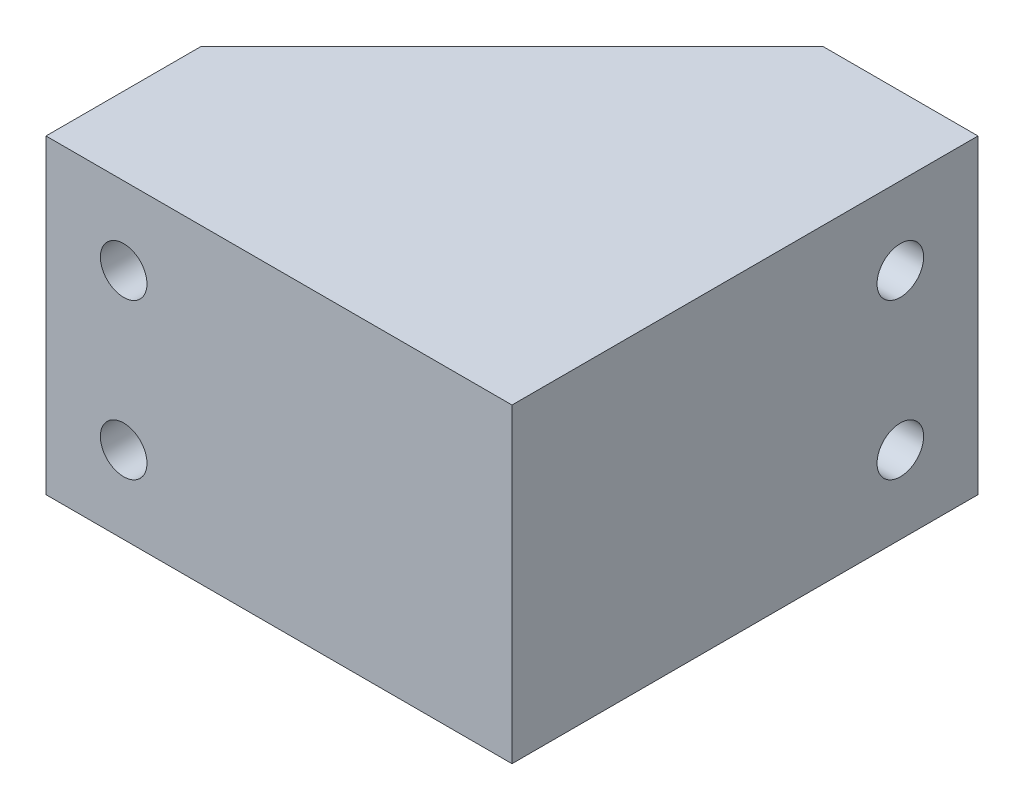
ISO-10303-21;
HEADER;
FILE_DESCRIPTION(('STEP AP214'),'2;1');
FILE_NAME('part.step','',(''),(''),'','','');
FILE_SCHEMA(('AUTOMOTIVE_DESIGN { 1 0 10303 214 1 1 1 1 }'));
ENDSEC;
DATA;
#1=APPLICATION_CONTEXT('core data for automotive mechanical design processes');
#2=APPLICATION_PROTOCOL_DEFINITION('international standard','automotive_design',2000,#1);
#3=PRODUCT_CONTEXT('',#1,'mechanical');
#4=PRODUCT('Part','Part','',(#3));
#5=PRODUCT_RELATED_PRODUCT_CATEGORY('part','',(#4));
#6=PRODUCT_DEFINITION_FORMATION('','',#4);
#7=PRODUCT_DEFINITION_CONTEXT('part definition',#1,'design');
#8=PRODUCT_DEFINITION('design','',#6,#7);
#9=PRODUCT_DEFINITION_SHAPE('','',#8);
#10=(LENGTH_UNIT() NAMED_UNIT(*) SI_UNIT(.MILLI.,.METRE.));
#11=(NAMED_UNIT(*) PLANE_ANGLE_UNIT() SI_UNIT($,.RADIAN.));
#12=(NAMED_UNIT(*) SI_UNIT($,.STERADIAN.) SOLID_ANGLE_UNIT());
#13=UNCERTAINTY_MEASURE_WITH_UNIT(LENGTH_MEASURE(1.E-05),#10,'distance_accuracy_value','');
#14=(GEOMETRIC_REPRESENTATION_CONTEXT(3) GLOBAL_UNCERTAINTY_ASSIGNED_CONTEXT((#13)) GLOBAL_UNIT_ASSIGNED_CONTEXT((#10,
#11,#12)) REPRESENTATION_CONTEXT('',''));
#15=CARTESIAN_POINT('',(0.,0.,0.));
#16=DIRECTION('',(0.,0.,1.));
#17=DIRECTION('',(1.,0.,0.));
#18=AXIS2_PLACEMENT_3D('',#15,#16,#17);
#19=CARTESIAN_POINT('',(-9.54784172661871,6.35,8.99964028776979));
#20=DIRECTION('',(1.,0.,0.));
#21=DIRECTION('',(0.,0.,-1.));
#22=AXIS2_PLACEMENT_3D('',#19,#20,#21);
#23=PLANE('',#22);
#24=DIRECTION('',(0.,0.,1.));
#25=VECTOR('',#24,1.);
#26=CARTESIAN_POINT('',(-9.54784172661871,-6.35,8.99964028776979));
#27=LINE('',#26,#25);
#28=CARTESIAN_POINT('',(-9.54784172661871,-6.35,2.64964028776979));
#29=VERTEX_POINT('',#28);
#30=CARTESIAN_POINT('',(-9.54784172661871,-6.35,8.99964028776979));
#31=VERTEX_POINT('',#30);
#32=EDGE_CURVE('E128',#29,#31,#27,.T.);
#33=ORIENTED_EDGE('',*,*,#32,.T.);
#34=DIRECTION('',(0.,-1.,0.));
#35=VECTOR('',#34,1.);
#36=CARTESIAN_POINT('',(-9.54784172661871,6.35,8.99964028776979));
#37=LINE('',#36,#35);
#38=CARTESIAN_POINT('',(-9.54784172661871,6.35,8.99964028776979));
#39=VERTEX_POINT('',#38);
#40=EDGE_CURVE('E11',#39,#31,#37,.T.);
#41=ORIENTED_EDGE('',*,*,#40,.F.);
#42=DIRECTION('',(0.,0.,1.));
#43=VECTOR('',#42,1.);
#44=CARTESIAN_POINT('',(-9.54784172661871,6.35,8.99964028776979));
#45=LINE('',#44,#43);
#46=CARTESIAN_POINT('',(-9.54784172661871,6.35,2.64964028776979));
#47=VERTEX_POINT('',#46);
#48=EDGE_CURVE('E142',#47,#39,#45,.T.);
#49=ORIENTED_EDGE('',*,*,#48,.F.);
#50=DIRECTION('',(0.,-1.,0.));
#51=VECTOR('',#50,1.);
#52=CARTESIAN_POINT('',(-9.54784172661871,6.35,2.64964028776979));
#53=LINE('',#52,#51);
#54=EDGE_CURVE('E124',#47,#29,#53,.T.);
#55=ORIENTED_EDGE('',*,*,#54,.T.);
#56=EDGE_LOOP('',(#33,#41,#49,#55));
#57=FACE_BOUND('',#56,.T.);
#58=ADVANCED_FACE('F47',(#57),#23,.F.);
#59=CARTESIAN_POINT('',(9.50215827338129,6.35,8.99964028776978));
#60=DIRECTION('',(0.,0.,-1.));
#61=DIRECTION('',(-1.,0.,0.));
#62=AXIS2_PLACEMENT_3D('',#59,#60,#61);
#63=PLANE('',#62);
#64=CARTESIAN_POINT('',(-6.37284172661871,-3.175,8.99964028776978));
#65=DIRECTION('',(0.,0.,1.));
#66=DIRECTION('',(1.,0.,0.));
#67=AXIS2_PLACEMENT_3D('',#64,#65,#66);
#68=CIRCLE('',#67,0.952499999999999);
#69=CARTESIAN_POINT('',(-5.42034172661871,-3.175,8.99964028776978));
#70=VERTEX_POINT('',#69);
#71=EDGE_CURVE('E159',#70,#70,#68,.T.);
#72=ORIENTED_EDGE('',*,*,#71,.F.);
#73=EDGE_LOOP('',(#72));
#74=FACE_BOUND('',#73,.T.);
#75=CARTESIAN_POINT('',(-6.37284172661871,3.175,8.99964028776978));
#76=DIRECTION('',(0.,0.,1.));
#77=DIRECTION('',(1.,0.,0.));
#78=AXIS2_PLACEMENT_3D('',#75,#76,#77);
#79=CIRCLE('',#78,0.952499999999999);
#80=CARTESIAN_POINT('',(-5.42034172661871,3.175,8.99964028776978));
#81=VERTEX_POINT('',#80);
#82=EDGE_CURVE('E167',#81,#81,#79,.T.);
#83=ORIENTED_EDGE('',*,*,#82,.F.);
#84=EDGE_LOOP('',(#83));
#85=FACE_BOUND('',#84,.T.);
#86=DIRECTION('',(1.,0.,0.));
#87=VECTOR('',#86,1.);
#88=CARTESIAN_POINT('',(9.50215827338129,-6.35,8.99964028776978));
#89=LINE('',#88,#87);
#90=CARTESIAN_POINT('',(9.50215827338129,-6.35,8.99964028776978));
#91=VERTEX_POINT('',#90);
#92=EDGE_CURVE('E132',#31,#91,#89,.T.);
#93=ORIENTED_EDGE('',*,*,#92,.T.);
#94=DIRECTION('',(0.,-1.,0.));
#95=VECTOR('',#94,1.);
#96=CARTESIAN_POINT('',(9.50215827338129,6.35,8.99964028776978));
#97=LINE('',#96,#95);
#98=CARTESIAN_POINT('',(9.50215827338129,6.35,8.99964028776978));
#99=VERTEX_POINT('',#98);
#100=EDGE_CURVE('E57',#99,#91,#97,.T.);
#101=ORIENTED_EDGE('',*,*,#100,.F.);
#102=DIRECTION('',(1.,0.,0.));
#103=VECTOR('',#102,1.);
#104=CARTESIAN_POINT('',(9.50215827338129,6.35,8.99964028776978));
#105=LINE('',#104,#103);
#106=EDGE_CURVE('E100',#39,#99,#105,.T.);
#107=ORIENTED_EDGE('',*,*,#106,.F.);
#108=ORIENTED_EDGE('',*,*,#40,.T.);
#109=EDGE_LOOP('',(#93,#101,#107,#108));
#110=FACE_BOUND('',#109,.T.);
#111=ADVANCED_FACE('F187',(#74,#85,#110),#63,.F.);
#112=CARTESIAN_POINT('',(9.50215827338129,6.35,-10.0503597122302));
#113=DIRECTION('',(-1.,0.,0.));
#114=DIRECTION('',(0.,0.,1.));
#115=AXIS2_PLACEMENT_3D('',#112,#113,#114);
#116=PLANE('',#115);
#117=CARTESIAN_POINT('',(9.50215827338129,3.175,-6.87535971223021));
#118=DIRECTION('',(1.,0.,0.));
#119=DIRECTION('',(0.,0.,-1.));
#120=AXIS2_PLACEMENT_3D('',#117,#118,#119);
#121=CIRCLE('',#120,0.9525);
#122=CARTESIAN_POINT('',(9.50215827338129,3.175,-7.82785971223022));
#123=VERTEX_POINT('',#122);
#124=EDGE_CURVE('E153',#123,#123,#121,.T.);
#125=ORIENTED_EDGE('',*,*,#124,.F.);
#126=EDGE_LOOP('',(#125));
#127=FACE_BOUND('',#126,.T.);
#128=CARTESIAN_POINT('',(9.50215827338129,-3.175,-6.87535971223021));
#129=DIRECTION('',(1.,0.,0.));
#130=DIRECTION('',(0.,0.,-1.));
#131=AXIS2_PLACEMENT_3D('',#128,#129,#130);
#132=CIRCLE('',#131,0.9525);
#133=CARTESIAN_POINT('',(9.50215827338129,-3.175,-7.82785971223022));
#134=VERTEX_POINT('',#133);
#135=EDGE_CURVE('E165',#134,#134,#132,.T.);
#136=ORIENTED_EDGE('',*,*,#135,.F.);
#137=EDGE_LOOP('',(#136));
#138=FACE_BOUND('',#137,.T.);
#139=DIRECTION('',(0.,0.,-1.));
#140=VECTOR('',#139,1.);
#141=CARTESIAN_POINT('',(9.50215827338129,-6.35,-10.0503597122302));
#142=LINE('',#141,#140);
#143=CARTESIAN_POINT('',(9.50215827338129,-6.35,-10.0503597122302));
#144=VERTEX_POINT('',#143);
#145=EDGE_CURVE('E116',#91,#144,#142,.T.);
#146=ORIENTED_EDGE('',*,*,#145,.T.);
#147=DIRECTION('',(0.,-1.,0.));
#148=VECTOR('',#147,1.);
#149=CARTESIAN_POINT('',(9.50215827338129,6.35,-10.0503597122302));
#150=LINE('',#149,#148);
#151=CARTESIAN_POINT('',(9.50215827338129,6.35,-10.0503597122302));
#152=VERTEX_POINT('',#151);
#153=EDGE_CURVE('E113',#152,#144,#150,.T.);
#154=ORIENTED_EDGE('',*,*,#153,.F.);
#155=DIRECTION('',(0.,0.,-1.));
#156=VECTOR('',#155,1.);
#157=CARTESIAN_POINT('',(9.50215827338129,6.35,-10.0503597122302));
#158=LINE('',#157,#156);
#159=EDGE_CURVE('E104',#99,#152,#158,.T.);
#160=ORIENTED_EDGE('',*,*,#159,.F.);
#161=ORIENTED_EDGE('',*,*,#100,.T.);
#162=EDGE_LOOP('',(#146,#154,#160,#161));
#163=FACE_BOUND('',#162,.T.);
#164=ADVANCED_FACE('F114',(#127,#138,#163),#116,.F.);
#165=CARTESIAN_POINT('',(3.15215827338129,6.35,-10.0503597122302));
#166=DIRECTION('',(0.,0.,1.));
#167=DIRECTION('',(1.,0.,0.));
#168=AXIS2_PLACEMENT_3D('',#165,#166,#167);
#169=PLANE('',#168);
#170=DIRECTION('',(-1.,0.,0.));
#171=VECTOR('',#170,1.);
#172=CARTESIAN_POINT('',(3.15215827338129,-6.35,-10.0503597122302));
#173=LINE('',#172,#171);
#174=CARTESIAN_POINT('',(3.15215827338129,-6.35,-10.0503597122302));
#175=VERTEX_POINT('',#174);
#176=EDGE_CURVE('E86',#144,#175,#173,.T.);
#177=ORIENTED_EDGE('',*,*,#176,.T.);
#178=DIRECTION('',(0.,-1.,0.));
#179=VECTOR('',#178,1.);
#180=CARTESIAN_POINT('',(3.15215827338129,6.35,-10.0503597122302));
#181=LINE('',#180,#179);
#182=CARTESIAN_POINT('',(3.15215827338129,6.35,-10.0503597122302));
#183=VERTEX_POINT('',#182);
#184=EDGE_CURVE('E118',#183,#175,#181,.T.);
#185=ORIENTED_EDGE('',*,*,#184,.F.);
#186=DIRECTION('',(-1.,0.,0.));
#187=VECTOR('',#186,1.);
#188=CARTESIAN_POINT('',(3.15215827338129,6.35,-10.0503597122302));
#189=LINE('',#188,#187);
#190=EDGE_CURVE('E108',#152,#183,#189,.T.);
#191=ORIENTED_EDGE('',*,*,#190,.F.);
#192=ORIENTED_EDGE('',*,*,#153,.T.);
#193=EDGE_LOOP('',(#177,#185,#191,#192));
#194=FACE_BOUND('',#193,.T.);
#195=ADVANCED_FACE('F120',(#194),#169,.F.);
#196=CARTESIAN_POINT('',(-9.54784172661871,6.35,2.64964028776979));
#197=DIRECTION('',(0.707106781186548,0.,0.707106781186547));
#198=DIRECTION('',(0.707106781186547,0.,-0.707106781186548));
#199=AXIS2_PLACEMENT_3D('',#196,#197,#198);
#200=PLANE('',#199);
#201=CARTESIAN_POINT('',(-6.37284172661871,-3.175,-0.525359712230215));
#202=DIRECTION('',(0.707106781186548,0.,0.707106781186547));
#203=DIRECTION('',(-0.707106781186547,0.,0.707106781186548));
#204=AXIS2_PLACEMENT_3D('',#201,#202,#203);
#205=ELLIPSE('',#204,1.34703841816037,0.952499999999999);
#206=CARTESIAN_POINT('',(-7.32534172661871,-3.175,0.427140287769785));
#207=VERTEX_POINT('',#206);
#208=EDGE_CURVE('E50',#207,#207,#205,.T.);
#209=ORIENTED_EDGE('',*,*,#208,.T.);
#210=EDGE_LOOP('',(#209));
#211=FACE_BOUND('',#210,.T.);
#212=CARTESIAN_POINT('',(-6.37284172661871,3.175,-0.525359712230215));
#213=DIRECTION('',(0.707106781186548,0.,0.707106781186547));
#214=DIRECTION('',(-0.707106781186547,0.,0.707106781186548));
#215=AXIS2_PLACEMENT_3D('',#212,#213,#214);
#216=ELLIPSE('',#215,1.34703841816037,0.952499999999999);
#217=CARTESIAN_POINT('',(-7.32534172661871,3.175,0.427140287769785));
#218=VERTEX_POINT('',#217);
#219=EDGE_CURVE('E156',#218,#218,#216,.T.);
#220=ORIENTED_EDGE('',*,*,#219,.T.);
#221=EDGE_LOOP('',(#220));
#222=FACE_BOUND('',#221,.T.);
#223=CARTESIAN_POINT('',(-0.0228417266187123,3.175,-6.87535971223021));
#224=DIRECTION('',(0.707106781186548,0.,0.707106781186547));
#225=DIRECTION('',(0.707106781186547,0.,-0.707106781186548));
#226=AXIS2_PLACEMENT_3D('',#223,#224,#225);
#227=ELLIPSE('',#226,1.34703841816037,0.9525);
#228=CARTESIAN_POINT('',(0.929658273381288,3.175,-7.82785971223021));
#229=VERTEX_POINT('',#228);
#230=EDGE_CURVE('E133',#229,#229,#227,.T.);
#231=ORIENTED_EDGE('',*,*,#230,.T.);
#232=EDGE_LOOP('',(#231));
#233=FACE_BOUND('',#232,.T.);
#234=CARTESIAN_POINT('',(-0.0228417266187123,-3.175,-6.87535971223021));
#235=DIRECTION('',(0.707106781186548,0.,0.707106781186547));
#236=DIRECTION('',(0.707106781186547,0.,-0.707106781186548));
#237=AXIS2_PLACEMENT_3D('',#234,#235,#236);
#238=ELLIPSE('',#237,1.34703841816037,0.9525);
#239=CARTESIAN_POINT('',(0.929658273381288,-3.175,-7.82785971223021));
#240=VERTEX_POINT('',#239);
#241=EDGE_CURVE('E149',#240,#240,#238,.T.);
#242=ORIENTED_EDGE('',*,*,#241,.T.);
#243=EDGE_LOOP('',(#242));
#244=FACE_BOUND('',#243,.T.);
#245=DIRECTION('',(-0.707106781186547,0.,0.707106781186548));
#246=VECTOR('',#245,1.);
#247=CARTESIAN_POINT('',(-9.54784172661871,-6.35,2.64964028776979));
#248=LINE('',#247,#246);
#249=EDGE_CURVE('E92',#175,#29,#248,.T.);
#250=ORIENTED_EDGE('',*,*,#249,.T.);
#251=ORIENTED_EDGE('',*,*,#54,.F.);
#252=DIRECTION('',(-0.707106781186547,0.,0.707106781186548));
#253=VECTOR('',#252,1.);
#254=CARTESIAN_POINT('',(-9.54784172661871,6.35,2.64964028776979));
#255=LINE('',#254,#253);
#256=EDGE_CURVE('E66',#183,#47,#255,.T.);
#257=ORIENTED_EDGE('',*,*,#256,.F.);
#258=ORIENTED_EDGE('',*,*,#184,.T.);
#259=EDGE_LOOP('',(#250,#251,#257,#258));
#260=FACE_BOUND('',#259,.T.);
#261=ADVANCED_FACE('F201',(#211,#222,#233,#244,#260),#200,.F.);
#262=CARTESIAN_POINT('',(0.,6.35,0.));
#263=DIRECTION('',(0.,-1.,0.));
#264=DIRECTION('',(0.,0.,-1.));
#265=AXIS2_PLACEMENT_3D('',#262,#263,#264);
#266=PLANE('',#265);
#267=ORIENTED_EDGE('',*,*,#48,.T.);
#268=ORIENTED_EDGE('',*,*,#106,.T.);
#269=ORIENTED_EDGE('',*,*,#159,.T.);
#270=ORIENTED_EDGE('',*,*,#190,.T.);
#271=ORIENTED_EDGE('',*,*,#256,.T.);
#272=EDGE_LOOP('',(#267,#268,#269,#270,#271));
#273=FACE_BOUND('',#272,.T.);
#274=ADVANCED_FACE('F106',(#273),#266,.F.);
#275=CARTESIAN_POINT('',(0.,-6.35,0.));
#276=DIRECTION('',(0.,-1.,0.));
#277=DIRECTION('',(0.,0.,-1.));
#278=AXIS2_PLACEMENT_3D('',#275,#276,#277);
#279=PLANE('',#278);
#280=ORIENTED_EDGE('',*,*,#32,.F.);
#281=ORIENTED_EDGE('',*,*,#249,.F.);
#282=ORIENTED_EDGE('',*,*,#176,.F.);
#283=ORIENTED_EDGE('',*,*,#145,.F.);
#284=ORIENTED_EDGE('',*,*,#92,.F.);
#285=EDGE_LOOP('',(#280,#281,#282,#283,#284));
#286=FACE_BOUND('',#285,.T.);
#287=ADVANCED_FACE('F189',(#286),#279,.T.);
#288=CARTESIAN_POINT('',(-9.54784172661871,-3.175,-6.87535971223021));
#289=DIRECTION('',(1.,0.,0.));
#290=DIRECTION('',(0.,0.,-1.));
#291=AXIS2_PLACEMENT_3D('',#288,#289,#290);
#292=CYLINDRICAL_SURFACE('',#291,0.9525);
#293=ORIENTED_EDGE('',*,*,#135,.T.);
#294=EDGE_LOOP('',(#293));
#295=FACE_BOUND('',#294,.T.);
#296=ORIENTED_EDGE('',*,*,#241,.F.);
#297=EDGE_LOOP('',(#296));
#298=FACE_BOUND('',#297,.T.);
#299=ADVANCED_FACE('F191',(#295,#298),#292,.F.);
#300=CARTESIAN_POINT('',(-9.54784172661871,3.175,-6.87535971223021));
#301=DIRECTION('',(1.,0.,0.));
#302=DIRECTION('',(0.,0.,-1.));
#303=AXIS2_PLACEMENT_3D('',#300,#301,#302);
#304=CYLINDRICAL_SURFACE('',#303,0.9525);
#305=ORIENTED_EDGE('',*,*,#124,.T.);
#306=EDGE_LOOP('',(#305));
#307=FACE_BOUND('',#306,.T.);
#308=ORIENTED_EDGE('',*,*,#230,.F.);
#309=EDGE_LOOP('',(#308));
#310=FACE_BOUND('',#309,.T.);
#311=ADVANCED_FACE('F198',(#307,#310),#304,.F.);
#312=CARTESIAN_POINT('',(-6.37284172661871,3.175,-10.0503597122302));
#313=DIRECTION('',(0.,0.,1.));
#314=DIRECTION('',(1.,0.,0.));
#315=AXIS2_PLACEMENT_3D('',#312,#313,#314);
#316=CYLINDRICAL_SURFACE('',#315,0.952499999999999);
#317=ORIENTED_EDGE('',*,*,#82,.T.);
#318=EDGE_LOOP('',(#317));
#319=FACE_BOUND('',#318,.T.);
#320=ORIENTED_EDGE('',*,*,#219,.F.);
#321=EDGE_LOOP('',(#320));
#322=FACE_BOUND('',#321,.T.);
#323=ADVANCED_FACE('F229',(#319,#322),#316,.F.);
#324=CARTESIAN_POINT('',(-6.37284172661871,-3.175,-10.0503597122302));
#325=DIRECTION('',(0.,0.,1.));
#326=DIRECTION('',(1.,0.,0.));
#327=AXIS2_PLACEMENT_3D('',#324,#325,#326);
#328=CYLINDRICAL_SURFACE('',#327,0.952499999999999);
#329=ORIENTED_EDGE('',*,*,#71,.T.);
#330=EDGE_LOOP('',(#329));
#331=FACE_BOUND('',#330,.T.);
#332=ORIENTED_EDGE('',*,*,#208,.F.);
#333=EDGE_LOOP('',(#332));
#334=FACE_BOUND('',#333,.T.);
#335=ADVANCED_FACE('F234',(#331,#334),#328,.F.);
#336=CLOSED_SHELL('',(#58,#111,#164,#195,#261,#274,#287,#299,#311,#323,#335));
#337=MANIFOLD_SOLID_BREP('B2',#336);
#338=ADVANCED_BREP_SHAPE_REPRESENTATION('',(#18,#337),#14);
#339=SHAPE_DEFINITION_REPRESENTATION(#9,#338);
ENDSEC;
END-ISO-10303-21;
